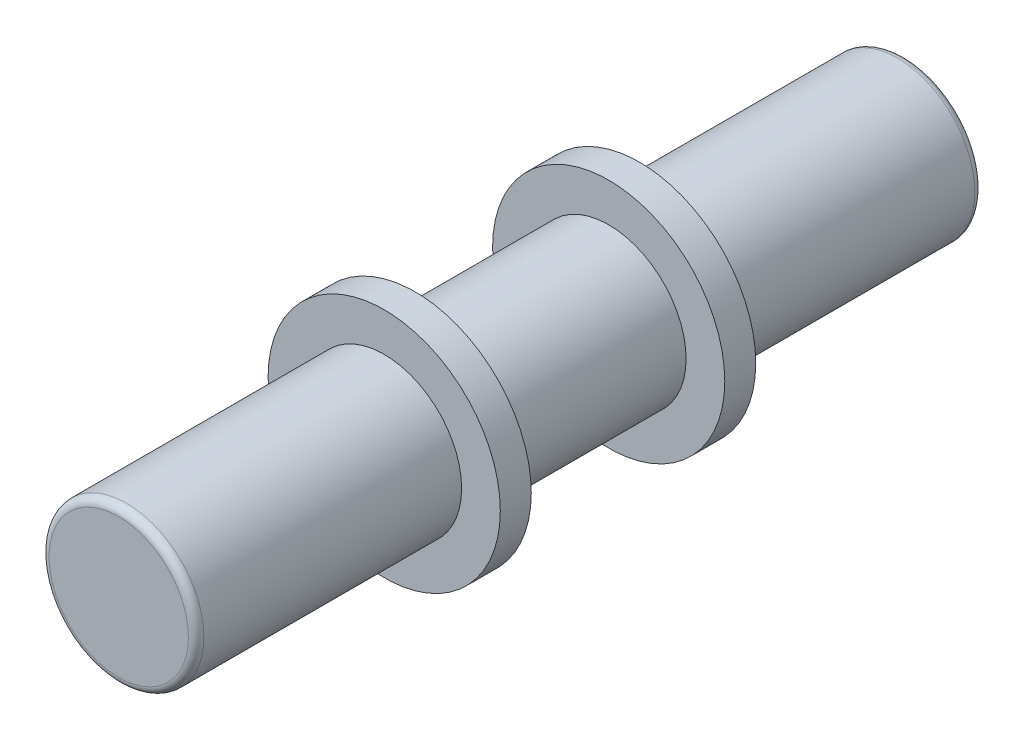
ISO-10303-21;
HEADER;
FILE_DESCRIPTION(('STEP AP214'),'2;1');
FILE_NAME('part.step','',(''),(''),'','','');
FILE_SCHEMA(('AUTOMOTIVE_DESIGN { 1 0 10303 214 1 1 1 1 }'));
ENDSEC;
DATA;
#1=APPLICATION_CONTEXT('core data for automotive mechanical design processes');
#2=APPLICATION_PROTOCOL_DEFINITION('international standard','automotive_design',2000,#1);
#3=PRODUCT_CONTEXT('',#1,'mechanical');
#4=PRODUCT('Part','Part','',(#3));
#5=PRODUCT_RELATED_PRODUCT_CATEGORY('part','',(#4));
#6=PRODUCT_DEFINITION_FORMATION('','',#4);
#7=PRODUCT_DEFINITION_CONTEXT('part definition',#1,'design');
#8=PRODUCT_DEFINITION('design','',#6,#7);
#9=PRODUCT_DEFINITION_SHAPE('','',#8);
#10=(LENGTH_UNIT() NAMED_UNIT(*) SI_UNIT(.MILLI.,.METRE.));
#11=(NAMED_UNIT(*) PLANE_ANGLE_UNIT() SI_UNIT($,.RADIAN.));
#12=(NAMED_UNIT(*) SI_UNIT($,.STERADIAN.) SOLID_ANGLE_UNIT());
#13=UNCERTAINTY_MEASURE_WITH_UNIT(LENGTH_MEASURE(1.E-05),#10,'distance_accuracy_value','');
#14=(GEOMETRIC_REPRESENTATION_CONTEXT(3) GLOBAL_UNCERTAINTY_ASSIGNED_CONTEXT((#13)) GLOBAL_UNIT_ASSIGNED_CONTEXT((#10,
#11,#12)) REPRESENTATION_CONTEXT('',''));
#15=CARTESIAN_POINT('',(0.,0.,0.));
#16=DIRECTION('',(0.,0.,1.));
#17=DIRECTION('',(1.,0.,0.));
#18=AXIS2_PLACEMENT_3D('',#15,#16,#17);
#19=CARTESIAN_POINT('',(0.,0.,12.5));
#20=DIRECTION('',(0.,0.,-1.));
#21=DIRECTION('',(-1.,0.,0.));
#22=AXIS2_PLACEMENT_3D('',#19,#20,#21);
#23=CYLINDRICAL_SURFACE('',#22,10.);
#24=CARTESIAN_POINT('',(0.,0.,12.5));
#25=DIRECTION('',(0.,0.,1.));
#26=DIRECTION('',(1.,0.,0.));
#27=AXIS2_PLACEMENT_3D('',#24,#25,#26);
#28=CIRCLE('',#27,10.);
#29=CARTESIAN_POINT('',(10.,0.,12.5));
#30=VERTEX_POINT('',#29);
#31=EDGE_CURVE('E61',#30,#30,#28,.T.);
#32=ORIENTED_EDGE('',*,*,#31,.F.);
#33=EDGE_LOOP('',(#32));
#34=FACE_BOUND('',#33,.T.);
#35=CARTESIAN_POINT('',(0.,0.,-12.5));
#36=DIRECTION('',(0.,0.,1.));
#37=DIRECTION('',(1.,0.,0.));
#38=AXIS2_PLACEMENT_3D('',#35,#36,#37);
#39=CIRCLE('',#38,10.);
#40=CARTESIAN_POINT('',(10.,0.,-12.5));
#41=VERTEX_POINT('',#40);
#42=EDGE_CURVE('E70',#41,#41,#39,.T.);
#43=ORIENTED_EDGE('',*,*,#42,.T.);
#44=EDGE_LOOP('',(#43));
#45=FACE_BOUND('',#44,.T.);
#46=ADVANCED_FACE('F36',(#34,#45),#23,.T.);
#47=CARTESIAN_POINT('',(0.,0.,16.5));
#48=DIRECTION('',(0.,0.,-1.));
#49=DIRECTION('',(-1.,0.,0.));
#50=AXIS2_PLACEMENT_3D('',#47,#48,#49);
#51=CYLINDRICAL_SURFACE('',#50,15.);
#52=CARTESIAN_POINT('',(0.,0.,16.5));
#53=DIRECTION('',(0.,0.,1.));
#54=DIRECTION('',(1.,0.,0.));
#55=AXIS2_PLACEMENT_3D('',#52,#53,#54);
#56=CIRCLE('',#55,15.);
#57=CARTESIAN_POINT('',(15.,0.,16.5));
#58=VERTEX_POINT('',#57);
#59=EDGE_CURVE('E65',#58,#58,#56,.T.);
#60=ORIENTED_EDGE('',*,*,#59,.F.);
#61=EDGE_LOOP('',(#60));
#62=FACE_BOUND('',#61,.T.);
#63=CARTESIAN_POINT('',(0.,0.,12.5));
#64=DIRECTION('',(0.,0.,1.));
#65=DIRECTION('',(1.,0.,0.));
#66=AXIS2_PLACEMENT_3D('',#63,#64,#65);
#67=CIRCLE('',#66,15.);
#68=CARTESIAN_POINT('',(15.,0.,12.5));
#69=VERTEX_POINT('',#68);
#70=EDGE_CURVE('E66',#69,#69,#67,.T.);
#71=ORIENTED_EDGE('',*,*,#70,.T.);
#72=EDGE_LOOP('',(#71));
#73=FACE_BOUND('',#72,.T.);
#74=ADVANCED_FACE('F114',(#62,#73),#51,.T.);
#75=CARTESIAN_POINT('',(0.,0.,16.5));
#76=DIRECTION('',(0.,0.,1.));
#77=DIRECTION('',(1.,0.,0.));
#78=AXIS2_PLACEMENT_3D('',#75,#76,#77);
#79=PLANE('',#78);
#80=CARTESIAN_POINT('',(0.,0.,16.5));
#81=DIRECTION('',(0.,0.,1.));
#82=DIRECTION('',(1.,0.,0.));
#83=AXIS2_PLACEMENT_3D('',#80,#81,#82);
#84=CIRCLE('',#83,10.);
#85=CARTESIAN_POINT('',(10.,0.,16.5));
#86=VERTEX_POINT('',#85);
#87=EDGE_CURVE('E60',#86,#86,#84,.T.);
#88=ORIENTED_EDGE('',*,*,#87,.F.);
#89=EDGE_LOOP('',(#88));
#90=FACE_BOUND('',#89,.T.);
#91=ORIENTED_EDGE('',*,*,#59,.T.);
#92=EDGE_LOOP('',(#91));
#93=FACE_BOUND('',#92,.T.);
#94=ADVANCED_FACE('F120',(#90,#93),#79,.T.);
#95=CARTESIAN_POINT('',(0.,0.,12.5));
#96=DIRECTION('',(0.,0.,1.));
#97=DIRECTION('',(1.,0.,0.));
#98=AXIS2_PLACEMENT_3D('',#95,#96,#97);
#99=PLANE('',#98);
#100=ORIENTED_EDGE('',*,*,#31,.T.);
#101=EDGE_LOOP('',(#100));
#102=FACE_BOUND('',#101,.T.);
#103=ORIENTED_EDGE('',*,*,#70,.F.);
#104=EDGE_LOOP('',(#103));
#105=FACE_BOUND('',#104,.T.);
#106=ADVANCED_FACE('F188',(#102,#105),#99,.F.);
#107=CARTESIAN_POINT('',(0.,0.,50.8));
#108=DIRECTION('',(0.,0.,-1.));
#109=DIRECTION('',(-1.,0.,0.));
#110=AXIS2_PLACEMENT_3D('',#107,#108,#109);
#111=CYLINDRICAL_SURFACE('',#110,10.);
#112=CARTESIAN_POINT('',(0.,0.,49.8));
#113=DIRECTION('',(0.,0.,1.));
#114=DIRECTION('',(1.,0.,0.));
#115=AXIS2_PLACEMENT_3D('',#112,#113,#114);
#116=CIRCLE('',#115,10.);
#117=CARTESIAN_POINT('',(10.,0.,49.8));
#118=VERTEX_POINT('',#117);
#119=EDGE_CURVE('E10',#118,#118,#116,.F.);
#120=ORIENTED_EDGE('',*,*,#119,.T.);
#121=EDGE_LOOP('',(#120));
#122=FACE_BOUND('',#121,.T.);
#123=ORIENTED_EDGE('',*,*,#87,.T.);
#124=EDGE_LOOP('',(#123));
#125=FACE_BOUND('',#124,.T.);
#126=ADVANCED_FACE('F179',(#122,#125),#111,.T.);
#127=CARTESIAN_POINT('',(0.,0.,50.8));
#128=DIRECTION('',(0.,0.,1.));
#129=DIRECTION('',(1.,0.,0.));
#130=AXIS2_PLACEMENT_3D('',#127,#128,#129);
#131=PLANE('',#130);
#132=CARTESIAN_POINT('',(0.,0.,50.8));
#133=DIRECTION('',(0.,0.,1.));
#134=DIRECTION('',(1.,0.,0.));
#135=AXIS2_PLACEMENT_3D('',#132,#133,#134);
#136=CIRCLE('',#135,9.);
#137=CARTESIAN_POINT('',(9.,0.,50.8));
#138=VERTEX_POINT('',#137);
#139=EDGE_CURVE('E44',#138,#138,#136,.T.);
#140=ORIENTED_EDGE('',*,*,#139,.T.);
#141=EDGE_LOOP('',(#140));
#142=FACE_BOUND('',#141,.T.);
#143=ADVANCED_FACE('F171',(#142),#131,.T.);
#144=CARTESIAN_POINT('',(0.,0.,-16.5));
#145=DIRECTION('',(0.,0.,1.));
#146=DIRECTION('',(1.,0.,0.));
#147=AXIS2_PLACEMENT_3D('',#144,#145,#146);
#148=CYLINDRICAL_SURFACE('',#147,15.);
#149=CARTESIAN_POINT('',(0.,0.,-16.5));
#150=DIRECTION('',(0.,0.,1.));
#151=DIRECTION('',(1.,0.,0.));
#152=AXIS2_PLACEMENT_3D('',#149,#150,#151);
#153=CIRCLE('',#152,15.);
#154=CARTESIAN_POINT('',(15.,0.,-16.5));
#155=VERTEX_POINT('',#154);
#156=EDGE_CURVE('E80',#155,#155,#153,.T.);
#157=ORIENTED_EDGE('',*,*,#156,.T.);
#158=EDGE_LOOP('',(#157));
#159=FACE_BOUND('',#158,.T.);
#160=CARTESIAN_POINT('',(0.,0.,-12.5));
#161=DIRECTION('',(0.,0.,1.));
#162=DIRECTION('',(1.,0.,0.));
#163=AXIS2_PLACEMENT_3D('',#160,#161,#162);
#164=CIRCLE('',#163,15.);
#165=CARTESIAN_POINT('',(15.,0.,-12.5));
#166=VERTEX_POINT('',#165);
#167=EDGE_CURVE('E81',#166,#166,#164,.T.);
#168=ORIENTED_EDGE('',*,*,#167,.F.);
#169=EDGE_LOOP('',(#168));
#170=FACE_BOUND('',#169,.T.);
#171=ADVANCED_FACE('F165',(#159,#170),#148,.T.);
#172=CARTESIAN_POINT('',(0.,0.,-16.5));
#173=DIRECTION('',(0.,0.,-1.));
#174=DIRECTION('',(1.,0.,0.));
#175=AXIS2_PLACEMENT_3D('',#172,#173,#174);
#176=PLANE('',#175);
#177=CARTESIAN_POINT('',(0.,0.,-16.5));
#178=DIRECTION('',(0.,0.,1.));
#179=DIRECTION('',(1.,0.,0.));
#180=AXIS2_PLACEMENT_3D('',#177,#178,#179);
#181=CIRCLE('',#180,10.);
#182=CARTESIAN_POINT('',(10.,0.,-16.5));
#183=VERTEX_POINT('',#182);
#184=EDGE_CURVE('E85',#183,#183,#181,.T.);
#185=ORIENTED_EDGE('',*,*,#184,.T.);
#186=EDGE_LOOP('',(#185));
#187=FACE_BOUND('',#186,.T.);
#188=ORIENTED_EDGE('',*,*,#156,.F.);
#189=EDGE_LOOP('',(#188));
#190=FACE_BOUND('',#189,.T.);
#191=ADVANCED_FACE('F93',(#187,#190),#176,.T.);
#192=CARTESIAN_POINT('',(0.,0.,-12.5));
#193=DIRECTION('',(0.,0.,-1.));
#194=DIRECTION('',(1.,0.,0.));
#195=AXIS2_PLACEMENT_3D('',#192,#193,#194);
#196=PLANE('',#195);
#197=ORIENTED_EDGE('',*,*,#42,.F.);
#198=EDGE_LOOP('',(#197));
#199=FACE_BOUND('',#198,.T.);
#200=ORIENTED_EDGE('',*,*,#167,.T.);
#201=EDGE_LOOP('',(#200));
#202=FACE_BOUND('',#201,.T.);
#203=ADVANCED_FACE('F99',(#199,#202),#196,.F.);
#204=CARTESIAN_POINT('',(0.,0.,-50.8));
#205=DIRECTION('',(0.,0.,1.));
#206=DIRECTION('',(1.,0.,0.));
#207=AXIS2_PLACEMENT_3D('',#204,#205,#206);
#208=CYLINDRICAL_SURFACE('',#207,10.);
#209=CARTESIAN_POINT('',(0.,0.,-49.8));
#210=DIRECTION('',(0.,0.,-1.));
#211=DIRECTION('',(-1.,0.,0.));
#212=AXIS2_PLACEMENT_3D('',#209,#210,#211);
#213=CIRCLE('',#212,10.);
#214=CARTESIAN_POINT('',(-10.,0.,-49.8));
#215=VERTEX_POINT('',#214);
#216=EDGE_CURVE('E54',#215,#215,#213,.F.);
#217=ORIENTED_EDGE('',*,*,#216,.T.);
#218=EDGE_LOOP('',(#217));
#219=FACE_BOUND('',#218,.T.);
#220=ORIENTED_EDGE('',*,*,#184,.F.);
#221=EDGE_LOOP('',(#220));
#222=FACE_BOUND('',#221,.T.);
#223=ADVANCED_FACE('F96',(#219,#222),#208,.T.);
#224=CARTESIAN_POINT('',(0.,0.,-50.8));
#225=DIRECTION('',(0.,0.,-1.));
#226=DIRECTION('',(1.,0.,0.));
#227=AXIS2_PLACEMENT_3D('',#224,#225,#226);
#228=PLANE('',#227);
#229=CARTESIAN_POINT('',(0.,0.,-50.8));
#230=DIRECTION('',(0.,0.,-1.));
#231=DIRECTION('',(-1.,0.,0.));
#232=AXIS2_PLACEMENT_3D('',#229,#230,#231);
#233=CIRCLE('',#232,9.);
#234=CARTESIAN_POINT('',(-9.,0.,-50.8));
#235=VERTEX_POINT('',#234);
#236=EDGE_CURVE('E49',#235,#235,#233,.T.);
#237=ORIENTED_EDGE('',*,*,#236,.T.);
#238=EDGE_LOOP('',(#237));
#239=FACE_BOUND('',#238,.T.);
#240=ADVANCED_FACE('F98',(#239),#228,.T.);
#241=CARTESIAN_POINT('',(0.,0.,-49.8));
#242=DIRECTION('',(0.,0.,-1.));
#243=DIRECTION('',(-1.,0.,0.));
#244=AXIS2_PLACEMENT_3D('',#241,#242,#243);
#245=TOROIDAL_SURFACE('',#244,9.,1.);
#246=ORIENTED_EDGE('',*,*,#236,.F.);
#247=EDGE_LOOP('',(#246));
#248=FACE_BOUND('',#247,.T.);
#249=ORIENTED_EDGE('',*,*,#216,.F.);
#250=EDGE_LOOP('',(#249));
#251=FACE_BOUND('',#250,.T.);
#252=ADVANCED_FACE('F106',(#248,#251),#245,.T.);
#253=CARTESIAN_POINT('',(0.,0.,49.8));
#254=DIRECTION('',(0.,0.,1.));
#255=DIRECTION('',(1.,0.,0.));
#256=AXIS2_PLACEMENT_3D('',#253,#254,#255);
#257=TOROIDAL_SURFACE('',#256,9.,1.);
#258=ORIENTED_EDGE('',*,*,#119,.F.);
#259=EDGE_LOOP('',(#258));
#260=FACE_BOUND('',#259,.T.);
#261=ORIENTED_EDGE('',*,*,#139,.F.);
#262=EDGE_LOOP('',(#261));
#263=FACE_BOUND('',#262,.T.);
#264=ADVANCED_FACE('F38',(#260,#263),#257,.T.);
#265=CLOSED_SHELL('',(#46,#74,#94,#106,#126,#143,#171,#191,#203,#223,#240,#252,#264));
#266=MANIFOLD_SOLID_BREP('B2',#265);
#267=ADVANCED_BREP_SHAPE_REPRESENTATION('',(#18,#266),#14);
#268=SHAPE_DEFINITION_REPRESENTATION(#9,#267);
ENDSEC;
END-ISO-10303-21;
